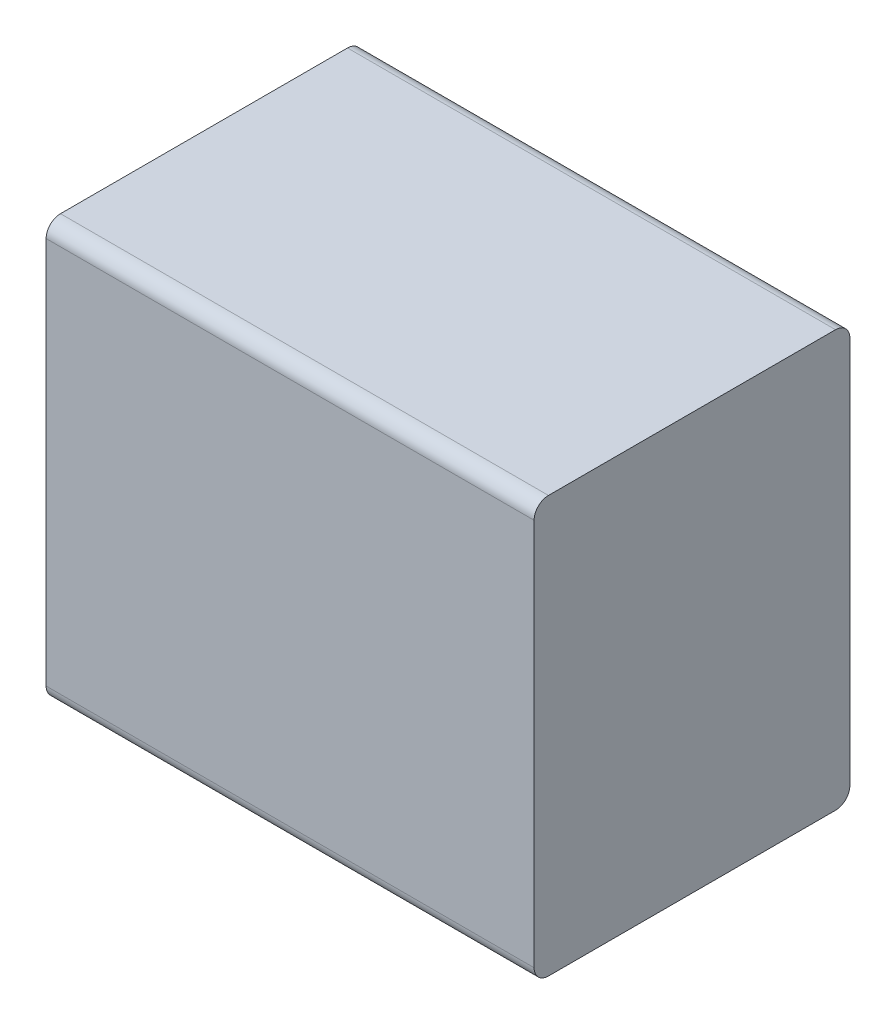
ISO-10303-21;
HEADER;
FILE_DESCRIPTION(('STEP AP214'),'2;1');
FILE_NAME('part.step','',(''),(''),'','','');
FILE_SCHEMA(('AUTOMOTIVE_DESIGN { 1 0 10303 214 1 1 1 1 }'));
ENDSEC;
DATA;
#1=APPLICATION_CONTEXT('core data for automotive mechanical design processes');
#2=APPLICATION_PROTOCOL_DEFINITION('international standard','automotive_design',2000,#1);
#3=PRODUCT_CONTEXT('',#1,'mechanical');
#4=PRODUCT('Part','Part','',(#3));
#5=PRODUCT_RELATED_PRODUCT_CATEGORY('part','',(#4));
#6=PRODUCT_DEFINITION_FORMATION('','',#4);
#7=PRODUCT_DEFINITION_CONTEXT('part definition',#1,'design');
#8=PRODUCT_DEFINITION('design','',#6,#7);
#9=PRODUCT_DEFINITION_SHAPE('','',#8);
#10=(LENGTH_UNIT() NAMED_UNIT(*) SI_UNIT(.MILLI.,.METRE.));
#11=(NAMED_UNIT(*) PLANE_ANGLE_UNIT() SI_UNIT($,.RADIAN.));
#12=(NAMED_UNIT(*) SI_UNIT($,.STERADIAN.) SOLID_ANGLE_UNIT());
#13=UNCERTAINTY_MEASURE_WITH_UNIT(LENGTH_MEASURE(1.E-05),#10,'distance_accuracy_value','');
#14=(GEOMETRIC_REPRESENTATION_CONTEXT(3) GLOBAL_UNCERTAINTY_ASSIGNED_CONTEXT((#13)) GLOBAL_UNIT_ASSIGNED_CONTEXT((#10,
#11,#12)) REPRESENTATION_CONTEXT('',''));
#15=CARTESIAN_POINT('',(0.,0.,0.));
#16=DIRECTION('',(0.,0.,1.));
#17=DIRECTION('',(1.,0.,0.));
#18=AXIS2_PLACEMENT_3D('',#15,#16,#17);
#19=CARTESIAN_POINT('',(0.,0.05,1.05));
#20=DIRECTION('',(1.,0.,0.));
#21=DIRECTION('',(0.,0.,-1.));
#22=AXIS2_PLACEMENT_3D('',#19,#20,#21);
#23=CYLINDRICAL_SURFACE('',#22,0.05);
#24=DIRECTION('',(1.,0.,0.));
#25=VECTOR('',#24,1.);
#26=CARTESIAN_POINT('',(0.,0.05,1.1));
#27=LINE('',#26,#25);
#28=CARTESIAN_POINT('',(0.25,0.05,1.1));
#29=VERTEX_POINT('',#28);
#30=CARTESIAN_POINT('',(1.95,0.05,1.1));
#31=VERTEX_POINT('',#30);
#32=EDGE_CURVE('E90',#29,#31,#27,.T.);
#33=ORIENTED_EDGE('',*,*,#32,.F.);
#34=CARTESIAN_POINT('',(0.25,0.05,1.05));
#35=DIRECTION('',(1.,0.,0.));
#36=DIRECTION('',(0.,0.,-1.));
#37=AXIS2_PLACEMENT_3D('',#34,#35,#36);
#38=CIRCLE('',#37,0.05);
#39=CARTESIAN_POINT('',(0.25,0.,1.05));
#40=VERTEX_POINT('',#39);
#41=EDGE_CURVE('E84',#29,#40,#38,.T.);
#42=ORIENTED_EDGE('',*,*,#41,.T.);
#43=DIRECTION('',(1.,0.,0.));
#44=VECTOR('',#43,1.);
#45=CARTESIAN_POINT('',(0.,0.,1.05));
#46=LINE('',#45,#44);
#47=CARTESIAN_POINT('',(1.95,0.,1.05));
#48=VERTEX_POINT('',#47);
#49=EDGE_CURVE('E86',#40,#48,#46,.T.);
#50=ORIENTED_EDGE('',*,*,#49,.T.);
#51=CARTESIAN_POINT('',(1.95,0.05,1.05));
#52=DIRECTION('',(1.,0.,0.));
#53=DIRECTION('',(0.,0.,-1.));
#54=AXIS2_PLACEMENT_3D('',#51,#52,#53);
#55=CIRCLE('',#54,0.05);
#56=EDGE_CURVE('E20',#48,#31,#55,.F.);
#57=ORIENTED_EDGE('',*,*,#56,.T.);
#58=EDGE_LOOP('',(#33,#42,#50,#57));
#59=FACE_BOUND('',#58,.T.);
#60=ADVANCED_FACE('F17',(#59),#23,.T.);
#61=CARTESIAN_POINT('',(0.,1.4,1.05));
#62=DIRECTION('',(1.,0.,0.));
#63=DIRECTION('',(0.,0.,-1.));
#64=AXIS2_PLACEMENT_3D('',#61,#62,#63);
#65=CYLINDRICAL_SURFACE('',#64,0.05);
#66=DIRECTION('',(1.,0.,0.));
#67=VECTOR('',#66,1.);
#68=CARTESIAN_POINT('',(0.,1.4,1.1));
#69=LINE('',#68,#67);
#70=CARTESIAN_POINT('',(1.95,1.4,1.1));
#71=VERTEX_POINT('',#70);
#72=CARTESIAN_POINT('',(0.25,1.4,1.1));
#73=VERTEX_POINT('',#72);
#74=EDGE_CURVE('E125',#71,#73,#69,.F.);
#75=ORIENTED_EDGE('',*,*,#74,.F.);
#76=CARTESIAN_POINT('',(1.95,1.4,1.05));
#77=DIRECTION('',(1.,0.,0.));
#78=DIRECTION('',(0.,0.,-1.));
#79=AXIS2_PLACEMENT_3D('',#76,#77,#78);
#80=CIRCLE('',#79,0.05);
#81=CARTESIAN_POINT('',(1.95,1.45,1.05));
#82=VERTEX_POINT('',#81);
#83=EDGE_CURVE('E91',#71,#82,#80,.F.);
#84=ORIENTED_EDGE('',*,*,#83,.T.);
#85=DIRECTION('',(1.,0.,0.));
#86=VECTOR('',#85,1.);
#87=CARTESIAN_POINT('',(0.,1.45,1.05));
#88=LINE('',#87,#86);
#89=CARTESIAN_POINT('',(0.25,1.45,1.05));
#90=VERTEX_POINT('',#89);
#91=EDGE_CURVE('E122',#90,#82,#88,.T.);
#92=ORIENTED_EDGE('',*,*,#91,.F.);
#93=CARTESIAN_POINT('',(0.25,1.4,1.05));
#94=DIRECTION('',(1.,0.,0.));
#95=DIRECTION('',(0.,0.,-1.));
#96=AXIS2_PLACEMENT_3D('',#93,#94,#95);
#97=CIRCLE('',#96,0.05);
#98=EDGE_CURVE('E136',#90,#73,#97,.T.);
#99=ORIENTED_EDGE('',*,*,#98,.T.);
#100=EDGE_LOOP('',(#75,#84,#92,#99));
#101=FACE_BOUND('',#100,.T.);
#102=ADVANCED_FACE('F140',(#101),#65,.T.);
#103=CARTESIAN_POINT('',(0.,0.,0.));
#104=DIRECTION('',(0.,1.,0.));
#105=DIRECTION('',(0.,0.,1.));
#106=AXIS2_PLACEMENT_3D('',#103,#104,#105);
#107=PLANE('',#106);
#108=ORIENTED_EDGE('',*,*,#49,.F.);
#109=DIRECTION('',(0.,0.,-1.));
#110=VECTOR('',#109,1.);
#111=CARTESIAN_POINT('',(0.25,0.,0.));
#112=LINE('',#111,#110);
#113=CARTESIAN_POINT('',(0.25,0.,0.05));
#114=VERTEX_POINT('',#113);
#115=EDGE_CURVE('E120',#40,#114,#112,.T.);
#116=ORIENTED_EDGE('',*,*,#115,.T.);
#117=DIRECTION('',(1.,0.,0.));
#118=VECTOR('',#117,1.);
#119=CARTESIAN_POINT('',(0.,0.,0.05));
#120=LINE('',#119,#118);
#121=CARTESIAN_POINT('',(1.95,0.,0.05));
#122=VERTEX_POINT('',#121);
#123=EDGE_CURVE('E94',#122,#114,#120,.F.);
#124=ORIENTED_EDGE('',*,*,#123,.F.);
#125=DIRECTION('',(0.,0.,-1.));
#126=VECTOR('',#125,1.);
#127=CARTESIAN_POINT('',(1.95,0.,0.));
#128=LINE('',#127,#126);
#129=EDGE_CURVE('E77',#48,#122,#128,.T.);
#130=ORIENTED_EDGE('',*,*,#129,.F.);
#131=EDGE_LOOP('',(#108,#116,#124,#130));
#132=FACE_BOUND('',#131,.T.);
#133=ADVANCED_FACE('F93',(#132),#107,.F.);
#134=CARTESIAN_POINT('',(0.,0.,1.1));
#135=DIRECTION('',(0.,0.,1.));
#136=DIRECTION('',(1.,0.,0.));
#137=AXIS2_PLACEMENT_3D('',#134,#135,#136);
#138=PLANE('',#137);
#139=DIRECTION('',(0.,1.,0.));
#140=VECTOR('',#139,1.);
#141=CARTESIAN_POINT('',(1.95,0.,1.1));
#142=LINE('',#141,#140);
#143=EDGE_CURVE('E80',#71,#31,#142,.F.);
#144=ORIENTED_EDGE('',*,*,#143,.F.);
#145=ORIENTED_EDGE('',*,*,#74,.T.);
#146=DIRECTION('',(0.,1.,0.));
#147=VECTOR('',#146,1.);
#148=CARTESIAN_POINT('',(0.25,0.,1.1));
#149=LINE('',#148,#147);
#150=EDGE_CURVE('E114',#73,#29,#149,.F.);
#151=ORIENTED_EDGE('',*,*,#150,.T.);
#152=ORIENTED_EDGE('',*,*,#32,.T.);
#153=EDGE_LOOP('',(#144,#145,#151,#152));
#154=FACE_BOUND('',#153,.T.);
#155=ADVANCED_FACE('F145',(#154),#138,.T.);
#156=CARTESIAN_POINT('',(0.,1.45,0.));
#157=DIRECTION('',(0.,1.,0.));
#158=DIRECTION('',(0.,0.,1.));
#159=AXIS2_PLACEMENT_3D('',#156,#157,#158);
#160=PLANE('',#159);
#161=ORIENTED_EDGE('',*,*,#91,.T.);
#162=DIRECTION('',(0.,0.,-1.));
#163=VECTOR('',#162,1.);
#164=CARTESIAN_POINT('',(1.95,1.45,0.));
#165=LINE('',#164,#163);
#166=CARTESIAN_POINT('',(1.95,1.45,0.05));
#167=VERTEX_POINT('',#166);
#168=EDGE_CURVE('E99',#167,#82,#165,.F.);
#169=ORIENTED_EDGE('',*,*,#168,.F.);
#170=DIRECTION('',(1.,0.,0.));
#171=VECTOR('',#170,1.);
#172=CARTESIAN_POINT('',(0.,1.45,0.05));
#173=LINE('',#172,#171);
#174=CARTESIAN_POINT('',(0.25,1.45,0.05));
#175=VERTEX_POINT('',#174);
#176=EDGE_CURVE('E123',#175,#167,#173,.T.);
#177=ORIENTED_EDGE('',*,*,#176,.F.);
#178=DIRECTION('',(0.,0.,-1.));
#179=VECTOR('',#178,1.);
#180=CARTESIAN_POINT('',(0.25,1.45,0.));
#181=LINE('',#180,#179);
#182=EDGE_CURVE('E117',#175,#90,#181,.F.);
#183=ORIENTED_EDGE('',*,*,#182,.T.);
#184=EDGE_LOOP('',(#161,#169,#177,#183));
#185=FACE_BOUND('',#184,.T.);
#186=ADVANCED_FACE('F174',(#185),#160,.T.);
#187=CARTESIAN_POINT('',(0.25,0.,0.));
#188=DIRECTION('',(1.,0.,0.));
#189=DIRECTION('',(0.,0.,-1.));
#190=AXIS2_PLACEMENT_3D('',#187,#188,#189);
#191=PLANE('',#190);
#192=ORIENTED_EDGE('',*,*,#150,.F.);
#193=ORIENTED_EDGE('',*,*,#98,.F.);
#194=ORIENTED_EDGE('',*,*,#182,.F.);
#195=CARTESIAN_POINT('',(0.25,1.4,0.05));
#196=DIRECTION('',(1.,0.,0.));
#197=DIRECTION('',(0.,0.,-1.));
#198=AXIS2_PLACEMENT_3D('',#195,#196,#197);
#199=CIRCLE('',#198,0.05);
#200=CARTESIAN_POINT('',(0.25,1.4,0.));
#201=VERTEX_POINT('',#200);
#202=EDGE_CURVE('E113',#201,#175,#199,.T.);
#203=ORIENTED_EDGE('',*,*,#202,.F.);
#204=DIRECTION('',(0.,1.,0.));
#205=VECTOR('',#204,1.);
#206=CARTESIAN_POINT('',(0.25,0.,0.));
#207=LINE('',#206,#205);
#208=CARTESIAN_POINT('',(0.25,0.05,0.));
#209=VERTEX_POINT('',#208);
#210=EDGE_CURVE('E108',#201,#209,#207,.F.);
#211=ORIENTED_EDGE('',*,*,#210,.T.);
#212=CARTESIAN_POINT('',(0.25,0.05,0.05));
#213=DIRECTION('',(1.,0.,0.));
#214=DIRECTION('',(0.,0.,-1.));
#215=AXIS2_PLACEMENT_3D('',#212,#213,#214);
#216=CIRCLE('',#215,0.05);
#217=EDGE_CURVE('E97',#114,#209,#216,.T.);
#218=ORIENTED_EDGE('',*,*,#217,.F.);
#219=ORIENTED_EDGE('',*,*,#115,.F.);
#220=ORIENTED_EDGE('',*,*,#41,.F.);
#221=EDGE_LOOP('',(#192,#193,#194,#203,#211,#218,#219,#220));
#222=FACE_BOUND('',#221,.T.);
#223=ADVANCED_FACE('F146',(#222),#191,.F.);
#224=CARTESIAN_POINT('',(0.,0.05,0.05));
#225=DIRECTION('',(1.,0.,0.));
#226=DIRECTION('',(0.,0.,-1.));
#227=AXIS2_PLACEMENT_3D('',#224,#225,#226);
#228=CYLINDRICAL_SURFACE('',#227,0.05);
#229=DIRECTION('',(1.,0.,0.));
#230=VECTOR('',#229,1.);
#231=CARTESIAN_POINT('',(0.,0.05,0.));
#232=LINE('',#231,#230);
#233=CARTESIAN_POINT('',(1.95,0.05,0.));
#234=VERTEX_POINT('',#233);
#235=EDGE_CURVE('E105',#209,#234,#232,.T.);
#236=ORIENTED_EDGE('',*,*,#235,.T.);
#237=CARTESIAN_POINT('',(1.95,0.05,0.05));
#238=DIRECTION('',(1.,0.,0.));
#239=DIRECTION('',(0.,0.,-1.));
#240=AXIS2_PLACEMENT_3D('',#237,#238,#239);
#241=CIRCLE('',#240,0.05);
#242=EDGE_CURVE('E96',#122,#234,#241,.T.);
#243=ORIENTED_EDGE('',*,*,#242,.F.);
#244=ORIENTED_EDGE('',*,*,#123,.T.);
#245=ORIENTED_EDGE('',*,*,#217,.T.);
#246=EDGE_LOOP('',(#236,#243,#244,#245));
#247=FACE_BOUND('',#246,.T.);
#248=ADVANCED_FACE('F166',(#247),#228,.T.);
#249=CARTESIAN_POINT('',(1.95,0.,0.));
#250=DIRECTION('',(1.,0.,0.));
#251=DIRECTION('',(0.,0.,-1.));
#252=AXIS2_PLACEMENT_3D('',#249,#250,#251);
#253=PLANE('',#252);
#254=ORIENTED_EDGE('',*,*,#143,.T.);
#255=ORIENTED_EDGE('',*,*,#56,.F.);
#256=ORIENTED_EDGE('',*,*,#129,.T.);
#257=ORIENTED_EDGE('',*,*,#242,.T.);
#258=DIRECTION('',(0.,1.,0.));
#259=VECTOR('',#258,1.);
#260=CARTESIAN_POINT('',(1.95,0.,0.));
#261=LINE('',#260,#259);
#262=CARTESIAN_POINT('',(1.95,1.4,0.));
#263=VERTEX_POINT('',#262);
#264=EDGE_CURVE('E26',#234,#263,#261,.T.);
#265=ORIENTED_EDGE('',*,*,#264,.T.);
#266=CARTESIAN_POINT('',(1.95,1.4,0.05));
#267=DIRECTION('',(1.,0.,0.));
#268=DIRECTION('',(0.,0.,-1.));
#269=AXIS2_PLACEMENT_3D('',#266,#267,#268);
#270=CIRCLE('',#269,0.05);
#271=EDGE_CURVE('E34',#167,#263,#270,.F.);
#272=ORIENTED_EDGE('',*,*,#271,.F.);
#273=ORIENTED_EDGE('',*,*,#168,.T.);
#274=ORIENTED_EDGE('',*,*,#83,.F.);
#275=EDGE_LOOP('',(#254,#255,#256,#257,#265,#272,#273,#274));
#276=FACE_BOUND('',#275,.T.);
#277=ADVANCED_FACE('F75',(#276),#253,.T.);
#278=CARTESIAN_POINT('',(0.,1.4,0.05));
#279=DIRECTION('',(1.,0.,0.));
#280=DIRECTION('',(0.,0.,-1.));
#281=AXIS2_PLACEMENT_3D('',#278,#279,#280);
#282=CYLINDRICAL_SURFACE('',#281,0.05);
#283=DIRECTION('',(1.,0.,0.));
#284=VECTOR('',#283,1.);
#285=CARTESIAN_POINT('',(0.,1.4,0.));
#286=LINE('',#285,#284);
#287=EDGE_CURVE('E11',#263,#201,#286,.F.);
#288=ORIENTED_EDGE('',*,*,#287,.T.);
#289=ORIENTED_EDGE('',*,*,#202,.T.);
#290=ORIENTED_EDGE('',*,*,#176,.T.);
#291=ORIENTED_EDGE('',*,*,#271,.T.);
#292=EDGE_LOOP('',(#288,#289,#290,#291));
#293=FACE_BOUND('',#292,.T.);
#294=ADVANCED_FACE('F157',(#293),#282,.T.);
#295=CARTESIAN_POINT('',(0.,0.,0.));
#296=DIRECTION('',(0.,0.,1.));
#297=DIRECTION('',(1.,0.,0.));
#298=AXIS2_PLACEMENT_3D('',#295,#296,#297);
#299=PLANE('',#298);
#300=ORIENTED_EDGE('',*,*,#264,.F.);
#301=ORIENTED_EDGE('',*,*,#235,.F.);
#302=ORIENTED_EDGE('',*,*,#210,.F.);
#303=ORIENTED_EDGE('',*,*,#287,.F.);
#304=EDGE_LOOP('',(#300,#301,#302,#303));
#305=FACE_BOUND('',#304,.T.);
#306=ADVANCED_FACE('F155',(#305),#299,.F.);
#307=CLOSED_SHELL('',(#60,#102,#133,#155,#186,#223,#248,#277,#294,#306));
#308=MANIFOLD_SOLID_BREP('B1',#307);
#309=ADVANCED_BREP_SHAPE_REPRESENTATION('',(#18,#308),#14);
#310=SHAPE_DEFINITION_REPRESENTATION(#9,#309);
ENDSEC;
END-ISO-10303-21;
